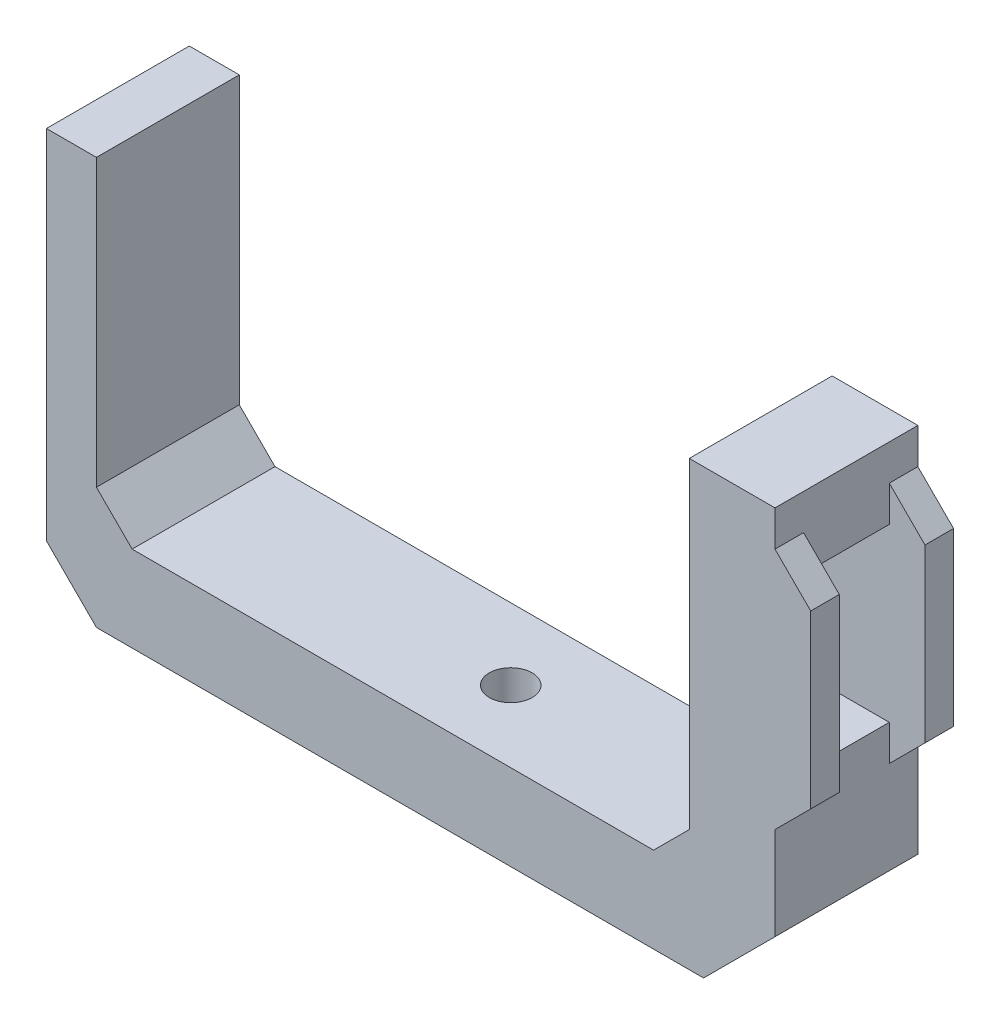
ISO-10303-21;
HEADER;
FILE_DESCRIPTION(('STEP AP214'),'2;1');
FILE_NAME('part.step','',(''),(''),'','','');
FILE_SCHEMA(('AUTOMOTIVE_DESIGN { 1 0 10303 214 1 1 1 1 }'));
ENDSEC;
DATA;
#1=APPLICATION_CONTEXT('core data for automotive mechanical design processes');
#2=APPLICATION_PROTOCOL_DEFINITION('international standard','automotive_design',2000,#1);
#3=PRODUCT_CONTEXT('',#1,'mechanical');
#4=PRODUCT('Part','Part','',(#3));
#5=PRODUCT_RELATED_PRODUCT_CATEGORY('part','',(#4));
#6=PRODUCT_DEFINITION_FORMATION('','',#4);
#7=PRODUCT_DEFINITION_CONTEXT('part definition',#1,'design');
#8=PRODUCT_DEFINITION('design','',#6,#7);
#9=PRODUCT_DEFINITION_SHAPE('','',#8);
#10=(LENGTH_UNIT() NAMED_UNIT(*) SI_UNIT(.MILLI.,.METRE.));
#11=(NAMED_UNIT(*) PLANE_ANGLE_UNIT() SI_UNIT($,.RADIAN.));
#12=(NAMED_UNIT(*) SI_UNIT($,.STERADIAN.) SOLID_ANGLE_UNIT());
#13=UNCERTAINTY_MEASURE_WITH_UNIT(LENGTH_MEASURE(1.E-05),#10,'distance_accuracy_value','');
#14=(GEOMETRIC_REPRESENTATION_CONTEXT(3) GLOBAL_UNCERTAINTY_ASSIGNED_CONTEXT((#13)) GLOBAL_UNIT_ASSIGNED_CONTEXT((#10,
#11,#12)) REPRESENTATION_CONTEXT('',''));
#15=CARTESIAN_POINT('',(0.,0.,0.));
#16=DIRECTION('',(0.,0.,1.));
#17=DIRECTION('',(1.,0.,0.));
#18=AXIS2_PLACEMENT_3D('',#15,#16,#17);
#19=CARTESIAN_POINT('',(-28.8,-11.88,20.));
#20=DIRECTION('',(0.,-1.,0.));
#21=DIRECTION('',(0.,0.,-1.));
#22=AXIS2_PLACEMENT_3D('',#19,#20,#21);
#23=PLANE('',#22);
#24=CARTESIAN_POINT('',(-18.8000000000001,-11.88,10.));
#25=DIRECTION('',(0.,1.,0.));
#26=DIRECTION('',(0.,0.,1.));
#27=AXIS2_PLACEMENT_3D('',#24,#25,#26);
#28=CIRCLE('',#27,3.);
#29=CARTESIAN_POINT('',(-18.8000000000001,-11.88,13.));
#30=VERTEX_POINT('',#29);
#31=EDGE_CURVE('E285',#30,#30,#28,.T.);
#32=ORIENTED_EDGE('',*,*,#31,.F.);
#33=EDGE_LOOP('',(#32));
#34=FACE_BOUND('',#33,.T.);
#35=DIRECTION('',(-1.,0.,0.));
#36=VECTOR('',#35,1.);
#37=CARTESIAN_POINT('',(-28.8,-11.88,0.));
#38=LINE('',#37,#36);
#39=CARTESIAN_POINT('',(11.1999999999999,-11.88,0.));
#40=VERTEX_POINT('',#39);
#41=CARTESIAN_POINT('',(-61.8,-11.88,0.));
#42=VERTEX_POINT('',#41);
#43=EDGE_CURVE('E313',#40,#42,#38,.T.);
#44=ORIENTED_EDGE('',*,*,#43,.T.);
#45=DIRECTION('',(0.,0.,1.));
#46=VECTOR('',#45,1.);
#47=CARTESIAN_POINT('',(-61.8,-11.88,20.));
#48=LINE('',#47,#46);
#49=CARTESIAN_POINT('',(-61.8,-11.88,20.));
#50=VERTEX_POINT('',#49);
#51=EDGE_CURVE('E387',#42,#50,#48,.T.);
#52=ORIENTED_EDGE('',*,*,#51,.T.);
#53=DIRECTION('',(-1.,0.,0.));
#54=VECTOR('',#53,1.);
#55=CARTESIAN_POINT('',(-28.8,-11.88,20.));
#56=LINE('',#55,#54);
#57=CARTESIAN_POINT('',(11.1999999999999,-11.88,20.));
#58=VERTEX_POINT('',#57);
#59=EDGE_CURVE('E298',#58,#50,#56,.T.);
#60=ORIENTED_EDGE('',*,*,#59,.F.);
#61=DIRECTION('',(0.,0.,-1.));
#62=VECTOR('',#61,1.);
#63=CARTESIAN_POINT('',(11.1999999999999,-11.88,0.));
#64=LINE('',#63,#62);
#65=EDGE_CURVE('E323',#58,#40,#64,.T.);
#66=ORIENTED_EDGE('',*,*,#65,.T.);
#67=EDGE_LOOP('',(#44,#52,#60,#66));
#68=FACE_BOUND('',#67,.T.);
#69=ADVANCED_FACE('F35',(#34,#68),#23,.F.);
#70=CARTESIAN_POINT('',(28.2,38.12,20.));
#71=DIRECTION('',(-1.,0.,0.));
#72=DIRECTION('',(0.,-1.,0.));
#73=AXIS2_PLACEMENT_3D('',#70,#71,#72);
#74=PLANE('',#73);
#75=DIRECTION('',(0.,0.,1.));
#76=VECTOR('',#75,1.);
#77=CARTESIAN_POINT('',(28.2,4.12,4.));
#78=LINE('',#77,#76);
#79=CARTESIAN_POINT('',(28.2,4.11999999999999,4.));
#80=VERTEX_POINT('',#79);
#81=CARTESIAN_POINT('',(28.2,4.12,16.));
#82=VERTEX_POINT('',#81);
#83=EDGE_CURVE('E251',#80,#82,#78,.T.);
#84=ORIENTED_EDGE('',*,*,#83,.T.);
#85=DIRECTION('',(0.,-1.,0.));
#86=VECTOR('',#85,1.);
#87=CARTESIAN_POINT('',(28.2,28.12,16.));
#88=LINE('',#87,#86);
#89=CARTESIAN_POINT('',(28.2,-0.879999999999991,16.));
#90=VERTEX_POINT('',#89);
#91=EDGE_CURVE('E355',#82,#90,#88,.T.);
#92=ORIENTED_EDGE('',*,*,#91,.T.);
#93=DIRECTION('',(0.,0.,1.));
#94=VECTOR('',#93,1.);
#95=CARTESIAN_POINT('',(28.2,-0.879999999999991,20.));
#96=LINE('',#95,#94);
#97=CARTESIAN_POINT('',(28.2,-0.879999999999992,20.));
#98=VERTEX_POINT('',#97);
#99=EDGE_CURVE('E353',#90,#98,#96,.T.);
#100=ORIENTED_EDGE('',*,*,#99,.T.);
#101=DIRECTION('',(0.,1.,0.));
#102=VECTOR('',#101,1.);
#103=CARTESIAN_POINT('',(28.2,38.12,20.));
#104=LINE('',#103,#102);
#105=CARTESIAN_POINT('',(28.2,-13.88,20.));
#106=VERTEX_POINT('',#105);
#107=EDGE_CURVE('E289',#106,#98,#104,.T.);
#108=ORIENTED_EDGE('',*,*,#107,.F.);
#109=DIRECTION('',(0.,0.,-1.));
#110=VECTOR('',#109,1.);
#111=CARTESIAN_POINT('',(28.2,-13.88,20.));
#112=LINE('',#111,#110);
#113=CARTESIAN_POINT('',(28.2,-13.88,0.));
#114=VERTEX_POINT('',#113);
#115=EDGE_CURVE('E332',#106,#114,#112,.T.);
#116=ORIENTED_EDGE('',*,*,#115,.T.);
#117=DIRECTION('',(0.,1.,0.));
#118=VECTOR('',#117,1.);
#119=CARTESIAN_POINT('',(28.2,38.12,0.));
#120=LINE('',#119,#118);
#121=CARTESIAN_POINT('',(28.2,-0.879999999999992,0.));
#122=VERTEX_POINT('',#121);
#123=EDGE_CURVE('E304',#114,#122,#120,.T.);
#124=ORIENTED_EDGE('',*,*,#123,.T.);
#125=DIRECTION('',(0.,0.,1.));
#126=VECTOR('',#125,1.);
#127=CARTESIAN_POINT('',(28.2,-0.879999999999991,4.));
#128=LINE('',#127,#126);
#129=CARTESIAN_POINT('',(28.2,-0.879999999999991,4.));
#130=VERTEX_POINT('',#129);
#131=EDGE_CURVE('E350',#122,#130,#128,.T.);
#132=ORIENTED_EDGE('',*,*,#131,.T.);
#133=DIRECTION('',(0.,1.,0.));
#134=VECTOR('',#133,1.);
#135=CARTESIAN_POINT('',(28.2,28.12,4.));
#136=LINE('',#135,#134);
#137=EDGE_CURVE('E343',#130,#80,#136,.T.);
#138=ORIENTED_EDGE('',*,*,#137,.T.);
#139=EDGE_LOOP('',(#84,#92,#100,#108,#116,#124,#132,#138));
#140=FACE_BOUND('',#139,.T.);
#141=ADVANCED_FACE('F443',(#140),#74,.F.);
#142=CARTESIAN_POINT('',(28.2,33.12,20.));
#143=VERTEX_POINT('',#142);
#144=CARTESIAN_POINT('',(28.2,38.12,20.));
#145=VERTEX_POINT('',#144);
#146=EDGE_CURVE('E293',#143,#145,#104,.T.);
#147=ORIENTED_EDGE('',*,*,#146,.F.);
#148=DIRECTION('',(0.,0.,-1.));
#149=VECTOR('',#148,1.);
#150=CARTESIAN_POINT('',(28.2,33.12,16.));
#151=LINE('',#150,#149);
#152=CARTESIAN_POINT('',(28.2,33.12,16.));
#153=VERTEX_POINT('',#152);
#154=EDGE_CURVE('E365',#143,#153,#151,.T.);
#155=ORIENTED_EDGE('',*,*,#154,.T.);
#156=DIRECTION('',(0.,-1.,0.));
#157=VECTOR('',#156,1.);
#158=CARTESIAN_POINT('',(28.2,28.12,16.));
#159=LINE('',#158,#157);
#160=CARTESIAN_POINT('',(28.2,28.12,16.));
#161=VERTEX_POINT('',#160);
#162=EDGE_CURVE('E363',#153,#161,#159,.T.);
#163=ORIENTED_EDGE('',*,*,#162,.T.);
#164=DIRECTION('',(0.,0.,-1.));
#165=VECTOR('',#164,1.);
#166=CARTESIAN_POINT('',(28.2,28.12,4.));
#167=LINE('',#166,#165);
#168=CARTESIAN_POINT('',(28.2,28.12,4.));
#169=VERTEX_POINT('',#168);
#170=EDGE_CURVE('E254',#161,#169,#167,.T.);
#171=ORIENTED_EDGE('',*,*,#170,.T.);
#172=DIRECTION('',(0.,1.,0.));
#173=VECTOR('',#172,1.);
#174=CARTESIAN_POINT('',(28.2,28.12,4.));
#175=LINE('',#174,#173);
#176=CARTESIAN_POINT('',(28.2,33.12,4.));
#177=VERTEX_POINT('',#176);
#178=EDGE_CURVE('E360',#169,#177,#175,.T.);
#179=ORIENTED_EDGE('',*,*,#178,.T.);
#180=DIRECTION('',(0.,0.,-1.));
#181=VECTOR('',#180,1.);
#182=CARTESIAN_POINT('',(28.2,33.12,0.));
#183=LINE('',#182,#181);
#184=CARTESIAN_POINT('',(28.2,33.12,0.));
#185=VERTEX_POINT('',#184);
#186=EDGE_CURVE('E358',#177,#185,#183,.T.);
#187=ORIENTED_EDGE('',*,*,#186,.T.);
#188=CARTESIAN_POINT('',(28.2,38.12,0.));
#189=VERTEX_POINT('',#188);
#190=EDGE_CURVE('E308',#185,#189,#120,.T.);
#191=ORIENTED_EDGE('',*,*,#190,.T.);
#192=DIRECTION('',(0.,0.,-1.));
#193=VECTOR('',#192,1.);
#194=CARTESIAN_POINT('',(28.2,38.12,20.));
#195=LINE('',#194,#193);
#196=EDGE_CURVE('E320',#145,#189,#195,.T.);
#197=ORIENTED_EDGE('',*,*,#196,.F.);
#198=EDGE_LOOP('',(#147,#155,#163,#171,#179,#187,#191,#197));
#199=FACE_BOUND('',#198,.T.);
#200=ADVANCED_FACE('F464',(#199),#74,.F.);
#201=CARTESIAN_POINT('',(-18.8000000000001,-31.88,10.));
#202=DIRECTION('',(0.,1.,0.));
#203=DIRECTION('',(0.,0.,1.));
#204=AXIS2_PLACEMENT_3D('',#201,#202,#203);
#205=CYLINDRICAL_SURFACE('',#204,1.75);
#206=CARTESIAN_POINT('',(-18.8000000000001,-23.88,10.));
#207=DIRECTION('',(0.,1.,0.));
#208=DIRECTION('',(0.,0.,1.));
#209=AXIS2_PLACEMENT_3D('',#206,#207,#208);
#210=CIRCLE('',#209,1.75);
#211=CARTESIAN_POINT('',(-18.8000000000001,-23.88,11.75));
#212=VERTEX_POINT('',#211);
#213=EDGE_CURVE('E344',#212,#212,#210,.T.);
#214=ORIENTED_EDGE('',*,*,#213,.F.);
#215=EDGE_LOOP('',(#214));
#216=FACE_BOUND('',#215,.T.);
#217=CARTESIAN_POINT('',(-18.8000000000001,-21.88,10.));
#218=DIRECTION('',(0.,1.,0.));
#219=DIRECTION('',(0.,0.,1.));
#220=AXIS2_PLACEMENT_3D('',#217,#218,#219);
#221=CIRCLE('',#220,1.75);
#222=CARTESIAN_POINT('',(-18.8000000000001,-21.88,11.75));
#223=VERTEX_POINT('',#222);
#224=EDGE_CURVE('E288',#223,#223,#221,.F.);
#225=ORIENTED_EDGE('',*,*,#224,.F.);
#226=EDGE_LOOP('',(#225));
#227=FACE_BOUND('',#226,.T.);
#228=ADVANCED_FACE('F475',(#216,#227),#205,.F.);
#229=CARTESIAN_POINT('',(16.2,38.12,20.));
#230=DIRECTION('',(0.,-1.,0.));
#231=DIRECTION('',(0.,0.,-1.));
#232=AXIS2_PLACEMENT_3D('',#229,#230,#231);
#233=PLANE('',#232);
#234=DIRECTION('',(-1.,0.,0.));
#235=VECTOR('',#234,1.);
#236=CARTESIAN_POINT('',(16.2,38.12,0.));
#237=LINE('',#236,#235);
#238=CARTESIAN_POINT('',(16.2,38.12,0.));
#239=VERTEX_POINT('',#238);
#240=EDGE_CURVE('E307',#189,#239,#237,.T.);
#241=ORIENTED_EDGE('',*,*,#240,.T.);
#242=DIRECTION('',(0.,0.,-1.));
#243=VECTOR('',#242,1.);
#244=CARTESIAN_POINT('',(16.2,38.12,20.));
#245=LINE('',#244,#243);
#246=CARTESIAN_POINT('',(16.2,38.12,20.));
#247=VERTEX_POINT('',#246);
#248=EDGE_CURVE('E303',#247,#239,#245,.T.);
#249=ORIENTED_EDGE('',*,*,#248,.F.);
#250=DIRECTION('',(-1.,0.,0.));
#251=VECTOR('',#250,1.);
#252=CARTESIAN_POINT('',(16.2,38.12,20.));
#253=LINE('',#252,#251);
#254=EDGE_CURVE('E292',#145,#247,#253,.T.);
#255=ORIENTED_EDGE('',*,*,#254,.F.);
#256=ORIENTED_EDGE('',*,*,#196,.T.);
#257=EDGE_LOOP('',(#241,#249,#255,#256));
#258=FACE_BOUND('',#257,.T.);
#259=ADVANCED_FACE('F420',(#258),#233,.F.);
#260=CARTESIAN_POINT('',(16.2,38.12,20.));
#261=DIRECTION('',(1.,0.,0.));
#262=DIRECTION('',(0.,1.,0.));
#263=AXIS2_PLACEMENT_3D('',#260,#261,#262);
#264=PLANE('',#263);
#265=DIRECTION('',(0.,0.,1.));
#266=VECTOR('',#265,1.);
#267=CARTESIAN_POINT('',(16.2,4.12,4.));
#268=LINE('',#267,#266);
#269=CARTESIAN_POINT('',(16.2,4.12,4.00000000000001));
#270=VERTEX_POINT('',#269);
#271=CARTESIAN_POINT('',(16.2,4.12,16.));
#272=VERTEX_POINT('',#271);
#273=EDGE_CURVE('E260',#270,#272,#268,.T.);
#274=ORIENTED_EDGE('',*,*,#273,.F.);
#275=DIRECTION('',(0.,-1.,0.));
#276=VECTOR('',#275,1.);
#277=CARTESIAN_POINT('',(16.2,28.12,4.));
#278=LINE('',#277,#276);
#279=CARTESIAN_POINT('',(16.2,28.12,4.));
#280=VERTEX_POINT('',#279);
#281=EDGE_CURVE('E250',#280,#270,#278,.T.);
#282=ORIENTED_EDGE('',*,*,#281,.F.);
#283=DIRECTION('',(0.,0.,-1.));
#284=VECTOR('',#283,1.);
#285=CARTESIAN_POINT('',(16.2,28.12,4.));
#286=LINE('',#285,#284);
#287=CARTESIAN_POINT('',(16.2,28.12,16.));
#288=VERTEX_POINT('',#287);
#289=EDGE_CURVE('E255',#288,#280,#286,.T.);
#290=ORIENTED_EDGE('',*,*,#289,.F.);
#291=DIRECTION('',(0.,1.,0.));
#292=VECTOR('',#291,1.);
#293=CARTESIAN_POINT('',(16.2,28.12,16.));
#294=LINE('',#293,#292);
#295=EDGE_CURVE('E263',#272,#288,#294,.T.);
#296=ORIENTED_EDGE('',*,*,#295,.F.);
#297=EDGE_LOOP('',(#274,#282,#290,#296));
#298=FACE_BOUND('',#297,.T.);
#299=DIRECTION('',(0.,-1.,0.));
#300=VECTOR('',#299,1.);
#301=CARTESIAN_POINT('',(16.2,38.12,0.));
#302=LINE('',#301,#300);
#303=CARTESIAN_POINT('',(16.2,-6.88,0.));
#304=VERTEX_POINT('',#303);
#305=EDGE_CURVE('E310',#239,#304,#302,.T.);
#306=ORIENTED_EDGE('',*,*,#305,.T.);
#307=DIRECTION('',(0.,0.,1.));
#308=VECTOR('',#307,1.);
#309=CARTESIAN_POINT('',(16.2,-6.88000000000001,20.));
#310=LINE('',#309,#308);
#311=CARTESIAN_POINT('',(16.2,-6.88,20.));
#312=VERTEX_POINT('',#311);
#313=EDGE_CURVE('E326',#304,#312,#310,.T.);
#314=ORIENTED_EDGE('',*,*,#313,.T.);
#315=DIRECTION('',(0.,-1.,0.));
#316=VECTOR('',#315,1.);
#317=CARTESIAN_POINT('',(16.2,38.12,20.));
#318=LINE('',#317,#316);
#319=EDGE_CURVE('E295',#247,#312,#318,.T.);
#320=ORIENTED_EDGE('',*,*,#319,.F.);
#321=ORIENTED_EDGE('',*,*,#248,.T.);
#322=EDGE_LOOP('',(#306,#314,#320,#321));
#323=FACE_BOUND('',#322,.T.);
#324=ADVANCED_FACE('F415',(#298,#323),#264,.F.);
#325=CARTESIAN_POINT('',(-28.8,-23.88,20.));
#326=DIRECTION('',(0.,1.,0.));
#327=DIRECTION('',(0.,0.,1.));
#328=AXIS2_PLACEMENT_3D('',#325,#326,#327);
#329=PLANE('',#328);
#330=ORIENTED_EDGE('',*,*,#213,.T.);
#331=EDGE_LOOP('',(#330));
#332=FACE_BOUND('',#331,.T.);
#333=DIRECTION('',(1.,0.,0.));
#334=VECTOR('',#333,1.);
#335=CARTESIAN_POINT('',(-28.8,-23.88,20.));
#336=LINE('',#335,#334);
#337=CARTESIAN_POINT('',(-66.8,-23.88,20.));
#338=VERTEX_POINT('',#337);
#339=CARTESIAN_POINT('',(18.2,-23.88,20.));
#340=VERTEX_POINT('',#339);
#341=EDGE_CURVE('E301',#338,#340,#336,.T.);
#342=ORIENTED_EDGE('',*,*,#341,.F.);
#343=DIRECTION('',(0.,0.,-1.));
#344=VECTOR('',#343,1.);
#345=CARTESIAN_POINT('',(-66.8,-23.88,0.));
#346=LINE('',#345,#344);
#347=CARTESIAN_POINT('',(-66.8,-23.88,0.));
#348=VERTEX_POINT('',#347);
#349=EDGE_CURVE('E43',#338,#348,#346,.T.);
#350=ORIENTED_EDGE('',*,*,#349,.T.);
#351=DIRECTION('',(1.,0.,0.));
#352=VECTOR('',#351,1.);
#353=CARTESIAN_POINT('',(-28.8,-23.88,0.));
#354=LINE('',#353,#352);
#355=CARTESIAN_POINT('',(18.2,-23.88,0.));
#356=VERTEX_POINT('',#355);
#357=EDGE_CURVE('E316',#348,#356,#354,.T.);
#358=ORIENTED_EDGE('',*,*,#357,.T.);
#359=DIRECTION('',(0.,0.,1.));
#360=VECTOR('',#359,1.);
#361=CARTESIAN_POINT('',(18.2,-23.88,20.));
#362=LINE('',#361,#360);
#363=EDGE_CURVE('E338',#356,#340,#362,.T.);
#364=ORIENTED_EDGE('',*,*,#363,.T.);
#365=EDGE_LOOP('',(#342,#350,#358,#364));
#366=FACE_BOUND('',#365,.T.);
#367=ADVANCED_FACE('F469',(#332,#366),#329,.F.);
#368=CARTESIAN_POINT('',(0.,0.,20.));
#369=DIRECTION('',(0.,0.,1.));
#370=DIRECTION('',(1.,0.,0.));
#371=AXIS2_PLACEMENT_3D('',#368,#369,#370);
#372=PLANE('',#371);
#373=DIRECTION('',(0.,1.,0.));
#374=VECTOR('',#373,1.);
#375=CARTESIAN_POINT('',(-73.8,-11.88,20.));
#376=LINE('',#375,#374);
#377=CARTESIAN_POINT('',(-73.8,-16.88,20.));
#378=VERTEX_POINT('',#377);
#379=CARTESIAN_POINT('',(-73.8,33.12,20.));
#380=VERTEX_POINT('',#379);
#381=EDGE_CURVE('E194',#378,#380,#376,.T.);
#382=ORIENTED_EDGE('',*,*,#381,.F.);
#383=DIRECTION('',(0.707106781186548,-0.707106781186547,0.));
#384=VECTOR('',#383,1.);
#385=CARTESIAN_POINT('',(-45.34,-45.34,20.));
#386=LINE('',#385,#384);
#387=EDGE_CURVE('E57',#378,#338,#386,.T.);
#388=ORIENTED_EDGE('',*,*,#387,.T.);
#389=ORIENTED_EDGE('',*,*,#341,.T.);
#390=DIRECTION('',(-0.707106781186549,-0.707106781186546,0.));
#391=VECTOR('',#390,1.);
#392=CARTESIAN_POINT('',(21.04,-21.04,20.));
#393=LINE('',#392,#391);
#394=EDGE_CURVE('E341',#340,#106,#393,.F.);
#395=ORIENTED_EDGE('',*,*,#394,.T.);
#396=ORIENTED_EDGE('',*,*,#107,.T.);
#397=DIRECTION('',(-0.707106781186552,-0.707106781186543,0.));
#398=VECTOR('',#397,1.);
#399=CARTESIAN_POINT('',(33.2,4.12,20.));
#400=LINE('',#399,#398);
#401=CARTESIAN_POINT('',(33.2,4.12,20.));
#402=VERTEX_POINT('',#401);
#403=EDGE_CURVE('E370',#98,#402,#400,.F.);
#404=ORIENTED_EDGE('',*,*,#403,.T.);
#405=DIRECTION('',(0.,-1.,0.));
#406=VECTOR('',#405,1.);
#407=CARTESIAN_POINT('',(33.2,28.12,20.));
#408=LINE('',#407,#406);
#409=CARTESIAN_POINT('',(33.2,28.12,20.));
#410=VERTEX_POINT('',#409);
#411=EDGE_CURVE('E244',#410,#402,#408,.T.);
#412=ORIENTED_EDGE('',*,*,#411,.F.);
#413=DIRECTION('',(0.707106781186553,-0.707106781186542,0.));
#414=VECTOR('',#413,1.);
#415=CARTESIAN_POINT('',(33.2,28.12,20.));
#416=LINE('',#415,#414);
#417=EDGE_CURVE('E376',#410,#143,#416,.F.);
#418=ORIENTED_EDGE('',*,*,#417,.T.);
#419=ORIENTED_EDGE('',*,*,#146,.T.);
#420=ORIENTED_EDGE('',*,*,#254,.T.);
#421=ORIENTED_EDGE('',*,*,#319,.T.);
#422=DIRECTION('',(0.70710678118655,0.707106781186545,0.));
#423=VECTOR('',#422,1.);
#424=CARTESIAN_POINT('',(11.1999999999999,-11.88,20.));
#425=LINE('',#424,#423);
#426=EDGE_CURVE('E330',#312,#58,#425,.F.);
#427=ORIENTED_EDGE('',*,*,#426,.T.);
#428=ORIENTED_EDGE('',*,*,#59,.T.);
#429=DIRECTION('',(0.707106781186544,-0.707106781186551,0.));
#430=VECTOR('',#429,1.);
#431=CARTESIAN_POINT('',(-66.8,-6.87999999999994,20.));
#432=LINE('',#431,#430);
#433=CARTESIAN_POINT('',(-66.8,-6.87999999999993,20.));
#434=VERTEX_POINT('',#433);
#435=EDGE_CURVE('E391',#50,#434,#432,.F.);
#436=ORIENTED_EDGE('',*,*,#435,.T.);
#437=DIRECTION('',(0.,-1.,0.));
#438=VECTOR('',#437,1.);
#439=CARTESIAN_POINT('',(-66.8,33.12,20.));
#440=LINE('',#439,#438);
#441=CARTESIAN_POINT('',(-66.8,33.12,20.));
#442=VERTEX_POINT('',#441);
#443=EDGE_CURVE('E209',#442,#434,#440,.T.);
#444=ORIENTED_EDGE('',*,*,#443,.F.);
#445=DIRECTION('',(1.,0.,0.));
#446=VECTOR('',#445,1.);
#447=CARTESIAN_POINT('',(-73.8,33.12,20.));
#448=LINE('',#447,#446);
#449=EDGE_CURVE('E206',#380,#442,#448,.T.);
#450=ORIENTED_EDGE('',*,*,#449,.F.);
#451=EDGE_LOOP('',(#382,#388,#389,#395,#396,#404,#412,#418,#419,#420,#421,#427,#428,#436,#444,#450));
#452=FACE_BOUND('',#451,.T.);
#453=ADVANCED_FACE('F207',(#452),#372,.T.);
#454=CARTESIAN_POINT('',(0.,0.,0.));
#455=DIRECTION('',(0.,0.,1.));
#456=DIRECTION('',(1.,0.,0.));
#457=AXIS2_PLACEMENT_3D('',#454,#455,#456);
#458=PLANE('',#457);
#459=ORIENTED_EDGE('',*,*,#357,.F.);
#460=DIRECTION('',(-0.707106781186548,0.707106781186547,0.));
#461=VECTOR('',#460,1.);
#462=CARTESIAN_POINT('',(-73.8,-16.88,0.));
#463=LINE('',#462,#461);
#464=CARTESIAN_POINT('',(-73.8,-16.88,0.));
#465=VERTEX_POINT('',#464);
#466=EDGE_CURVE('E11',#348,#465,#463,.T.);
#467=ORIENTED_EDGE('',*,*,#466,.T.);
#468=DIRECTION('',(0.,-1.,0.));
#469=VECTOR('',#468,1.);
#470=CARTESIAN_POINT('',(-73.8,-11.88,0.));
#471=LINE('',#470,#469);
#472=CARTESIAN_POINT('',(-73.8,33.12,0.));
#473=VERTEX_POINT('',#472);
#474=EDGE_CURVE('E203',#473,#465,#471,.T.);
#475=ORIENTED_EDGE('',*,*,#474,.F.);
#476=DIRECTION('',(-1.,0.,0.));
#477=VECTOR('',#476,1.);
#478=CARTESIAN_POINT('',(-73.8,33.12,0.));
#479=LINE('',#478,#477);
#480=CARTESIAN_POINT('',(-66.8,33.12,0.));
#481=VERTEX_POINT('',#480);
#482=EDGE_CURVE('E217',#481,#473,#479,.T.);
#483=ORIENTED_EDGE('',*,*,#482,.F.);
#484=DIRECTION('',(0.,-1.,0.));
#485=VECTOR('',#484,1.);
#486=CARTESIAN_POINT('',(-66.8,33.12,0.));
#487=LINE('',#486,#485);
#488=CARTESIAN_POINT('',(-66.8,-6.87999999999993,0.));
#489=VERTEX_POINT('',#488);
#490=EDGE_CURVE('E222',#481,#489,#487,.T.);
#491=ORIENTED_EDGE('',*,*,#490,.T.);
#492=DIRECTION('',(-0.707106781186544,0.707106781186551,0.));
#493=VECTOR('',#492,1.);
#494=CARTESIAN_POINT('',(-36.8400000000003,-36.8399999999999,0.));
#495=LINE('',#494,#493);
#496=EDGE_CURVE('E389',#489,#42,#495,.F.);
#497=ORIENTED_EDGE('',*,*,#496,.T.);
#498=ORIENTED_EDGE('',*,*,#43,.F.);
#499=DIRECTION('',(-0.70710678118655,-0.707106781186545,0.));
#500=VECTOR('',#499,1.);
#501=CARTESIAN_POINT('',(11.5399999999999,-11.54,0.));
#502=LINE('',#501,#500);
#503=EDGE_CURVE('E328',#40,#304,#502,.F.);
#504=ORIENTED_EDGE('',*,*,#503,.T.);
#505=ORIENTED_EDGE('',*,*,#305,.F.);
#506=ORIENTED_EDGE('',*,*,#240,.F.);
#507=ORIENTED_EDGE('',*,*,#190,.F.);
#508=DIRECTION('',(-0.707106781186553,0.707106781186542,0.));
#509=VECTOR('',#508,1.);
#510=CARTESIAN_POINT('',(30.6599999999998,30.6600000000002,0.));
#511=LINE('',#510,#509);
#512=CARTESIAN_POINT('',(33.2,28.12,0.));
#513=VERTEX_POINT('',#512);
#514=EDGE_CURVE('E382',#185,#513,#511,.F.);
#515=ORIENTED_EDGE('',*,*,#514,.T.);
#516=DIRECTION('',(0.,1.,0.));
#517=VECTOR('',#516,1.);
#518=CARTESIAN_POINT('',(33.2,28.12,0.));
#519=LINE('',#518,#517);
#520=CARTESIAN_POINT('',(33.2,4.12,0.));
#521=VERTEX_POINT('',#520);
#522=EDGE_CURVE('E232',#521,#513,#519,.T.);
#523=ORIENTED_EDGE('',*,*,#522,.F.);
#524=DIRECTION('',(0.707106781186552,0.707106781186543,0.));
#525=VECTOR('',#524,1.);
#526=CARTESIAN_POINT('',(14.5399999999998,-14.54,0.));
#527=LINE('',#526,#525);
#528=EDGE_CURVE('E372',#521,#122,#527,.F.);
#529=ORIENTED_EDGE('',*,*,#528,.T.);
#530=ORIENTED_EDGE('',*,*,#123,.F.);
#531=DIRECTION('',(0.707106781186549,0.707106781186546,0.));
#532=VECTOR('',#531,1.);
#533=CARTESIAN_POINT('',(28.2,-13.88,0.));
#534=LINE('',#533,#532);
#535=EDGE_CURVE('E335',#114,#356,#534,.F.);
#536=ORIENTED_EDGE('',*,*,#535,.T.);
#537=EDGE_LOOP('',(#459,#467,#475,#483,#491,#497,#498,#504,#505,#506,#507,#515,#523,#529,#530,#536));
#538=FACE_BOUND('',#537,.T.);
#539=ADVANCED_FACE('F405',(#538),#458,.F.);
#540=CARTESIAN_POINT('',(11.1999999999999,-11.88,20.));
#541=DIRECTION('',(-0.707106781186545,0.707106781186551,0.));
#542=DIRECTION('',(0.,0.,1.));
#543=AXIS2_PLACEMENT_3D('',#540,#541,#542);
#544=PLANE('',#543);
#545=ORIENTED_EDGE('',*,*,#426,.F.);
#546=ORIENTED_EDGE('',*,*,#313,.F.);
#547=ORIENTED_EDGE('',*,*,#503,.F.);
#548=ORIENTED_EDGE('',*,*,#65,.F.);
#549=EDGE_LOOP('',(#545,#546,#547,#548));
#550=FACE_BOUND('',#549,.T.);
#551=ADVANCED_FACE('F410',(#550),#544,.T.);
#552=CARTESIAN_POINT('',(28.2,-13.88,20.));
#553=DIRECTION('',(-0.707106781186546,0.707106781186549,0.));
#554=DIRECTION('',(0.,0.,-1.));
#555=AXIS2_PLACEMENT_3D('',#552,#553,#554);
#556=PLANE('',#555);
#557=ORIENTED_EDGE('',*,*,#394,.F.);
#558=ORIENTED_EDGE('',*,*,#363,.F.);
#559=ORIENTED_EDGE('',*,*,#535,.F.);
#560=ORIENTED_EDGE('',*,*,#115,.F.);
#561=EDGE_LOOP('',(#557,#558,#559,#560));
#562=FACE_BOUND('',#561,.T.);
#563=ADVANCED_FACE('F448',(#562),#556,.F.);
#564=CARTESIAN_POINT('',(-18.8000000000001,-21.88,10.));
#565=DIRECTION('',(0.,1.,0.));
#566=DIRECTION('',(0.,0.,1.));
#567=AXIS2_PLACEMENT_3D('',#564,#565,#566);
#568=CYLINDRICAL_SURFACE('',#567,3.);
#569=CARTESIAN_POINT('',(-18.8000000000001,-19.88,10.));
#570=DIRECTION('',(0.,1.,0.));
#571=DIRECTION('',(0.,0.,1.));
#572=AXIS2_PLACEMENT_3D('',#569,#570,#571);
#573=CIRCLE('',#572,3.);
#574=CARTESIAN_POINT('',(-18.8000000000001,-19.88,13.));
#575=VERTEX_POINT('',#574);
#576=EDGE_CURVE('E280',#575,#575,#573,.T.);
#577=ORIENTED_EDGE('',*,*,#576,.F.);
#578=EDGE_LOOP('',(#577));
#579=FACE_BOUND('',#578,.T.);
#580=ORIENTED_EDGE('',*,*,#31,.T.);
#581=EDGE_LOOP('',(#580));
#582=FACE_BOUND('',#581,.T.);
#583=ADVANCED_FACE('F481',(#579,#582),#568,.F.);
#584=CARTESIAN_POINT('',(-18.8000000000001,-19.88,10.));
#585=DIRECTION('',(0.,1.,0.));
#586=DIRECTION('',(0.,0.,1.));
#587=AXIS2_PLACEMENT_3D('',#584,#585,#586);
#588=PLANE('',#587);
#589=CARTESIAN_POINT('',(-18.8000000000001,-19.88,10.));
#590=DIRECTION('',(0.,1.,0.));
#591=DIRECTION('',(0.,0.,1.));
#592=AXIS2_PLACEMENT_3D('',#589,#590,#591);
#593=CIRCLE('',#592,1.);
#594=CARTESIAN_POINT('',(-18.8000000000001,-19.88,11.));
#595=VERTEX_POINT('',#594);
#596=EDGE_CURVE('E270',#595,#595,#593,.T.);
#597=ORIENTED_EDGE('',*,*,#596,.F.);
#598=EDGE_LOOP('',(#597));
#599=FACE_BOUND('',#598,.T.);
#600=ORIENTED_EDGE('',*,*,#576,.T.);
#601=EDGE_LOOP('',(#600));
#602=FACE_BOUND('',#601,.T.);
#603=ADVANCED_FACE('F528',(#599,#602),#588,.T.);
#604=CARTESIAN_POINT('',(-18.8000000000001,-21.88,10.));
#605=DIRECTION('',(0.,1.,0.));
#606=DIRECTION('',(0.,0.,1.));
#607=AXIS2_PLACEMENT_3D('',#604,#605,#606);
#608=PLANE('',#607);
#609=CARTESIAN_POINT('',(-18.8000000000001,-21.88,10.));
#610=DIRECTION('',(0.,1.,0.));
#611=DIRECTION('',(0.,0.,1.));
#612=AXIS2_PLACEMENT_3D('',#609,#610,#611);
#613=CIRCLE('',#612,1.);
#614=CARTESIAN_POINT('',(-18.8000000000001,-21.88,11.));
#615=VERTEX_POINT('',#614);
#616=EDGE_CURVE('E277',#615,#615,#613,.T.);
#617=ORIENTED_EDGE('',*,*,#616,.T.);
#618=EDGE_LOOP('',(#617));
#619=FACE_BOUND('',#618,.T.);
#620=ORIENTED_EDGE('',*,*,#224,.T.);
#621=EDGE_LOOP('',(#620));
#622=FACE_BOUND('',#621,.T.);
#623=ADVANCED_FACE('F526',(#619,#622),#608,.F.);
#624=CARTESIAN_POINT('',(-18.8000000000001,-21.88,10.));
#625=DIRECTION('',(0.,1.,0.));
#626=DIRECTION('',(0.,0.,1.));
#627=AXIS2_PLACEMENT_3D('',#624,#625,#626);
#628=CYLINDRICAL_SURFACE('',#627,1.);
#629=ORIENTED_EDGE('',*,*,#616,.F.);
#630=EDGE_LOOP('',(#629));
#631=FACE_BOUND('',#630,.T.);
#632=ORIENTED_EDGE('',*,*,#596,.T.);
#633=EDGE_LOOP('',(#632));
#634=FACE_BOUND('',#633,.T.);
#635=ADVANCED_FACE('F523',(#631,#634),#628,.F.);
#636=CARTESIAN_POINT('',(28.2,28.12,4.));
#637=DIRECTION('',(0.,0.,-1.));
#638=DIRECTION('',(0.,1.,0.));
#639=AXIS2_PLACEMENT_3D('',#636,#637,#638);
#640=PLANE('',#639);
#641=ORIENTED_EDGE('',*,*,#281,.T.);
#642=DIRECTION('',(-1.,0.,0.));
#643=VECTOR('',#642,1.);
#644=CARTESIAN_POINT('',(28.2,4.12,4.));
#645=LINE('',#644,#643);
#646=EDGE_CURVE('E258',#80,#270,#645,.T.);
#647=ORIENTED_EDGE('',*,*,#646,.F.);
#648=ORIENTED_EDGE('',*,*,#137,.F.);
#649=DIRECTION('',(-0.707106781186552,-0.707106781186543,0.));
#650=VECTOR('',#649,1.);
#651=CARTESIAN_POINT('',(42.7,13.6199999999998,4.));
#652=LINE('',#651,#650);
#653=CARTESIAN_POINT('',(33.2,4.12,4.));
#654=VERTEX_POINT('',#653);
#655=EDGE_CURVE('E374',#130,#654,#652,.F.);
#656=ORIENTED_EDGE('',*,*,#655,.T.);
#657=DIRECTION('',(0.,-1.,0.));
#658=VECTOR('',#657,1.);
#659=CARTESIAN_POINT('',(33.2,28.12,4.));
#660=LINE('',#659,#658);
#661=CARTESIAN_POINT('',(33.2,28.12,4.));
#662=VERTEX_POINT('',#661);
#663=EDGE_CURVE('E202',#662,#654,#660,.T.);
#664=ORIENTED_EDGE('',*,*,#663,.F.);
#665=DIRECTION('',(0.707106781186553,-0.707106781186542,0.));
#666=VECTOR('',#665,1.);
#667=CARTESIAN_POINT('',(30.7,30.62,4.));
#668=LINE('',#667,#666);
#669=EDGE_CURVE('E380',#662,#177,#668,.F.);
#670=ORIENTED_EDGE('',*,*,#669,.T.);
#671=ORIENTED_EDGE('',*,*,#178,.F.);
#672=DIRECTION('',(-1.,0.,0.));
#673=VECTOR('',#672,1.);
#674=CARTESIAN_POINT('',(28.2,28.12,4.));
#675=LINE('',#674,#673);
#676=EDGE_CURVE('E268',#169,#280,#675,.T.);
#677=ORIENTED_EDGE('',*,*,#676,.T.);
#678=EDGE_LOOP('',(#641,#647,#648,#656,#664,#670,#671,#677));
#679=FACE_BOUND('',#678,.T.);
#680=ADVANCED_FACE('F435',(#679),#640,.F.);
#681=CARTESIAN_POINT('',(28.2,28.12,4.));
#682=DIRECTION('',(0.,1.,0.));
#683=DIRECTION('',(-1.,0.,0.));
#684=AXIS2_PLACEMENT_3D('',#681,#682,#683);
#685=PLANE('',#684);
#686=ORIENTED_EDGE('',*,*,#289,.T.);
#687=ORIENTED_EDGE('',*,*,#676,.F.);
#688=ORIENTED_EDGE('',*,*,#170,.F.);
#689=DIRECTION('',(-1.,0.,0.));
#690=VECTOR('',#689,1.);
#691=CARTESIAN_POINT('',(28.2,28.12,16.));
#692=LINE('',#691,#690);
#693=EDGE_CURVE('E271',#161,#288,#692,.T.);
#694=ORIENTED_EDGE('',*,*,#693,.T.);
#695=EDGE_LOOP('',(#686,#687,#688,#694));
#696=FACE_BOUND('',#695,.T.);
#697=ADVANCED_FACE('F510',(#696),#685,.F.);
#698=CARTESIAN_POINT('',(28.2,28.12,16.));
#699=DIRECTION('',(0.,0.,1.));
#700=DIRECTION('',(0.,-1.,0.));
#701=AXIS2_PLACEMENT_3D('',#698,#699,#700);
#702=PLANE('',#701);
#703=ORIENTED_EDGE('',*,*,#295,.T.);
#704=ORIENTED_EDGE('',*,*,#693,.F.);
#705=ORIENTED_EDGE('',*,*,#162,.F.);
#706=DIRECTION('',(-0.707106781186553,0.707106781186542,0.));
#707=VECTOR('',#706,1.);
#708=CARTESIAN_POINT('',(30.7,30.62,16.));
#709=LINE('',#708,#707);
#710=CARTESIAN_POINT('',(33.2,28.12,16.));
#711=VERTEX_POINT('',#710);
#712=EDGE_CURVE('E378',#153,#711,#709,.F.);
#713=ORIENTED_EDGE('',*,*,#712,.T.);
#714=DIRECTION('',(0.,1.,0.));
#715=VECTOR('',#714,1.);
#716=CARTESIAN_POINT('',(33.2,28.12,16.));
#717=LINE('',#716,#715);
#718=CARTESIAN_POINT('',(33.2,4.12,16.));
#719=VERTEX_POINT('',#718);
#720=EDGE_CURVE('E238',#719,#711,#717,.T.);
#721=ORIENTED_EDGE('',*,*,#720,.F.);
#722=DIRECTION('',(0.707106781186552,0.707106781186543,0.));
#723=VECTOR('',#722,1.);
#724=CARTESIAN_POINT('',(42.7,13.6199999999998,16.));
#725=LINE('',#724,#723);
#726=EDGE_CURVE('E368',#719,#90,#725,.F.);
#727=ORIENTED_EDGE('',*,*,#726,.T.);
#728=ORIENTED_EDGE('',*,*,#91,.F.);
#729=DIRECTION('',(-1.,0.,0.));
#730=VECTOR('',#729,1.);
#731=CARTESIAN_POINT('',(28.2,4.12,16.));
#732=LINE('',#731,#730);
#733=EDGE_CURVE('E273',#82,#272,#732,.T.);
#734=ORIENTED_EDGE('',*,*,#733,.T.);
#735=EDGE_LOOP('',(#703,#704,#705,#713,#721,#727,#728,#734));
#736=FACE_BOUND('',#735,.T.);
#737=ADVANCED_FACE('F513',(#736),#702,.F.);
#738=CARTESIAN_POINT('',(28.2,4.12,4.));
#739=DIRECTION('',(0.,-1.,0.));
#740=DIRECTION('',(1.,0.,0.));
#741=AXIS2_PLACEMENT_3D('',#738,#739,#740);
#742=PLANE('',#741);
#743=ORIENTED_EDGE('',*,*,#273,.T.);
#744=ORIENTED_EDGE('',*,*,#733,.F.);
#745=ORIENTED_EDGE('',*,*,#83,.F.);
#746=ORIENTED_EDGE('',*,*,#646,.T.);
#747=EDGE_LOOP('',(#743,#744,#745,#746));
#748=FACE_BOUND('',#747,.T.);
#749=ADVANCED_FACE('F508',(#748),#742,.F.);
#750=CARTESIAN_POINT('',(33.2,0.,0.));
#751=DIRECTION('',(-1.,0.,0.));
#752=DIRECTION('',(0.,-1.,0.));
#753=AXIS2_PLACEMENT_3D('',#750,#751,#752);
#754=PLANE('',#753);
#755=ORIENTED_EDGE('',*,*,#720,.T.);
#756=DIRECTION('',(0.,0.,1.));
#757=VECTOR('',#756,1.);
#758=CARTESIAN_POINT('',(33.2,28.12,16.));
#759=LINE('',#758,#757);
#760=EDGE_CURVE('E241',#711,#410,#759,.T.);
#761=ORIENTED_EDGE('',*,*,#760,.T.);
#762=ORIENTED_EDGE('',*,*,#411,.T.);
#763=DIRECTION('',(0.,0.,-1.));
#764=VECTOR('',#763,1.);
#765=CARTESIAN_POINT('',(33.2,4.12,16.));
#766=LINE('',#765,#764);
#767=EDGE_CURVE('E247',#402,#719,#766,.T.);
#768=ORIENTED_EDGE('',*,*,#767,.T.);
#769=EDGE_LOOP('',(#755,#761,#762,#768));
#770=FACE_BOUND('',#769,.T.);
#771=ADVANCED_FACE('F505',(#770),#754,.F.);
#772=CARTESIAN_POINT('',(33.2,0.,0.));
#773=DIRECTION('',(1.,0.,0.));
#774=DIRECTION('',(0.,1.,0.));
#775=AXIS2_PLACEMENT_3D('',#772,#773,#774);
#776=PLANE('',#775);
#777=ORIENTED_EDGE('',*,*,#663,.T.);
#778=DIRECTION('',(0.,0.,-1.));
#779=VECTOR('',#778,1.);
#780=CARTESIAN_POINT('',(33.2,4.12,4.));
#781=LINE('',#780,#779);
#782=EDGE_CURVE('E229',#654,#521,#781,.T.);
#783=ORIENTED_EDGE('',*,*,#782,.T.);
#784=ORIENTED_EDGE('',*,*,#522,.T.);
#785=DIRECTION('',(0.,0.,1.));
#786=VECTOR('',#785,1.);
#787=CARTESIAN_POINT('',(33.2,28.12,4.));
#788=LINE('',#787,#786);
#789=EDGE_CURVE('E235',#513,#662,#788,.T.);
#790=ORIENTED_EDGE('',*,*,#789,.T.);
#791=EDGE_LOOP('',(#777,#783,#784,#790));
#792=FACE_BOUND('',#791,.T.);
#793=ADVANCED_FACE('F432',(#792),#776,.T.);
#794=CARTESIAN_POINT('',(33.2,4.12,16.));
#795=DIRECTION('',(0.707106781186543,-0.707106781186552,0.));
#796=DIRECTION('',(0.,0.,1.));
#797=AXIS2_PLACEMENT_3D('',#794,#795,#796);
#798=PLANE('',#797);
#799=ORIENTED_EDGE('',*,*,#403,.F.);
#800=ORIENTED_EDGE('',*,*,#99,.F.);
#801=ORIENTED_EDGE('',*,*,#726,.F.);
#802=ORIENTED_EDGE('',*,*,#767,.F.);
#803=EDGE_LOOP('',(#799,#800,#801,#802));
#804=FACE_BOUND('',#803,.T.);
#805=ADVANCED_FACE('F482',(#804),#798,.T.);
#806=CARTESIAN_POINT('',(33.2,4.12,4.));
#807=DIRECTION('',(0.707106781186543,-0.707106781186552,0.));
#808=DIRECTION('',(0.,0.,1.));
#809=AXIS2_PLACEMENT_3D('',#806,#807,#808);
#810=PLANE('',#809);
#811=ORIENTED_EDGE('',*,*,#655,.F.);
#812=ORIENTED_EDGE('',*,*,#131,.F.);
#813=ORIENTED_EDGE('',*,*,#528,.F.);
#814=ORIENTED_EDGE('',*,*,#782,.F.);
#815=EDGE_LOOP('',(#811,#812,#813,#814));
#816=FACE_BOUND('',#815,.T.);
#817=ADVANCED_FACE('F440',(#816),#810,.T.);
#818=CARTESIAN_POINT('',(33.2,28.12,16.));
#819=DIRECTION('',(0.707106781186542,0.707106781186553,0.));
#820=DIRECTION('',(0.,0.,-1.));
#821=AXIS2_PLACEMENT_3D('',#818,#819,#820);
#822=PLANE('',#821);
#823=ORIENTED_EDGE('',*,*,#712,.F.);
#824=ORIENTED_EDGE('',*,*,#154,.F.);
#825=ORIENTED_EDGE('',*,*,#417,.F.);
#826=ORIENTED_EDGE('',*,*,#760,.F.);
#827=EDGE_LOOP('',(#823,#824,#825,#826));
#828=FACE_BOUND('',#827,.T.);
#829=ADVANCED_FACE('F488',(#828),#822,.T.);
#830=CARTESIAN_POINT('',(33.2,28.12,4.));
#831=DIRECTION('',(0.707106781186542,0.707106781186553,0.));
#832=DIRECTION('',(0.,0.,-1.));
#833=AXIS2_PLACEMENT_3D('',#830,#831,#832);
#834=PLANE('',#833);
#835=ORIENTED_EDGE('',*,*,#514,.F.);
#836=ORIENTED_EDGE('',*,*,#186,.F.);
#837=ORIENTED_EDGE('',*,*,#669,.F.);
#838=ORIENTED_EDGE('',*,*,#789,.F.);
#839=EDGE_LOOP('',(#835,#836,#837,#838));
#840=FACE_BOUND('',#839,.T.);
#841=ADVANCED_FACE('F429',(#840),#834,.T.);
#842=CARTESIAN_POINT('',(-73.8,0.,0.));
#843=DIRECTION('',(-1.,0.,0.));
#844=DIRECTION('',(0.,-1.,0.));
#845=AXIS2_PLACEMENT_3D('',#842,#843,#844);
#846=PLANE('',#845);
#847=ORIENTED_EDGE('',*,*,#474,.T.);
#848=DIRECTION('',(0.,0.,1.));
#849=VECTOR('',#848,1.);
#850=CARTESIAN_POINT('',(-73.8,-16.88,20.));
#851=LINE('',#850,#849);
#852=EDGE_CURVE('E201',#465,#378,#851,.T.);
#853=ORIENTED_EDGE('',*,*,#852,.T.);
#854=ORIENTED_EDGE('',*,*,#381,.T.);
#855=DIRECTION('',(0.,0.,1.));
#856=VECTOR('',#855,1.);
#857=CARTESIAN_POINT('',(-73.8,33.12,20.));
#858=LINE('',#857,#856);
#859=EDGE_CURVE('E199',#473,#380,#858,.T.);
#860=ORIENTED_EDGE('',*,*,#859,.F.);
#861=EDGE_LOOP('',(#847,#853,#854,#860));
#862=FACE_BOUND('',#861,.T.);
#863=ADVANCED_FACE('F197',(#862),#846,.T.);
#864=CARTESIAN_POINT('',(-66.8,33.12,20.));
#865=DIRECTION('',(-1.,0.,0.));
#866=DIRECTION('',(0.,0.,1.));
#867=AXIS2_PLACEMENT_3D('',#864,#865,#866);
#868=PLANE('',#867);
#869=ORIENTED_EDGE('',*,*,#443,.T.);
#870=DIRECTION('',(0.,0.,-1.));
#871=VECTOR('',#870,1.);
#872=CARTESIAN_POINT('',(-66.8,-6.87999999999994,0.));
#873=LINE('',#872,#871);
#874=EDGE_CURVE('E384',#434,#489,#873,.T.);
#875=ORIENTED_EDGE('',*,*,#874,.T.);
#876=ORIENTED_EDGE('',*,*,#490,.F.);
#877=DIRECTION('',(0.,0.,-1.));
#878=VECTOR('',#877,1.);
#879=CARTESIAN_POINT('',(-66.8,33.12,20.));
#880=LINE('',#879,#878);
#881=EDGE_CURVE('E212',#442,#481,#880,.T.);
#882=ORIENTED_EDGE('',*,*,#881,.F.);
#883=EDGE_LOOP('',(#869,#875,#876,#882));
#884=FACE_BOUND('',#883,.T.);
#885=ADVANCED_FACE('F400',(#884),#868,.F.);
#886=CARTESIAN_POINT('',(0.,33.12,0.));
#887=DIRECTION('',(0.,-1.,0.));
#888=DIRECTION('',(0.,0.,-1.));
#889=AXIS2_PLACEMENT_3D('',#886,#887,#888);
#890=PLANE('',#889);
#891=ORIENTED_EDGE('',*,*,#859,.T.);
#892=ORIENTED_EDGE('',*,*,#449,.T.);
#893=ORIENTED_EDGE('',*,*,#881,.T.);
#894=ORIENTED_EDGE('',*,*,#482,.T.);
#895=EDGE_LOOP('',(#891,#892,#893,#894));
#896=FACE_BOUND('',#895,.T.);
#897=ADVANCED_FACE('F215',(#896),#890,.F.);
#898=CARTESIAN_POINT('',(-66.8,-6.87999999999994,20.));
#899=DIRECTION('',(0.707106781186551,0.707106781186543,0.));
#900=DIRECTION('',(0.,0.,1.));
#901=AXIS2_PLACEMENT_3D('',#898,#899,#900);
#902=PLANE('',#901);
#903=ORIENTED_EDGE('',*,*,#435,.F.);
#904=ORIENTED_EDGE('',*,*,#51,.F.);
#905=ORIENTED_EDGE('',*,*,#496,.F.);
#906=ORIENTED_EDGE('',*,*,#874,.F.);
#907=EDGE_LOOP('',(#903,#904,#905,#906));
#908=FACE_BOUND('',#907,.T.);
#909=ADVANCED_FACE('F402',(#908),#902,.T.);
#910=CARTESIAN_POINT('',(-73.8,-16.88,0.));
#911=DIRECTION('',(-0.707106781186547,-0.707106781186548,0.));
#912=DIRECTION('',(0.,0.,-1.));
#913=AXIS2_PLACEMENT_3D('',#910,#911,#912);
#914=PLANE('',#913);
#915=ORIENTED_EDGE('',*,*,#466,.F.);
#916=ORIENTED_EDGE('',*,*,#349,.F.);
#917=ORIENTED_EDGE('',*,*,#387,.F.);
#918=ORIENTED_EDGE('',*,*,#852,.F.);
#919=EDGE_LOOP('',(#915,#916,#917,#918));
#920=FACE_BOUND('',#919,.T.);
#921=ADVANCED_FACE('F37',(#920),#914,.T.);
#922=CLOSED_SHELL('',(#69,#141,#200,#228,#259,#324,#367,#453,#539,#551,#563,#583,#603,#623,#635,
#680,#697,#737,#749,#771,#793,#805,#817,#829,#841,#863,#885,#897,#909,#921));
#923=MANIFOLD_SOLID_BREP('B2',#922);
#924=ADVANCED_BREP_SHAPE_REPRESENTATION('',(#18,#923),#14);
#925=SHAPE_DEFINITION_REPRESENTATION(#9,#924);
ENDSEC;
END-ISO-10303-21;
